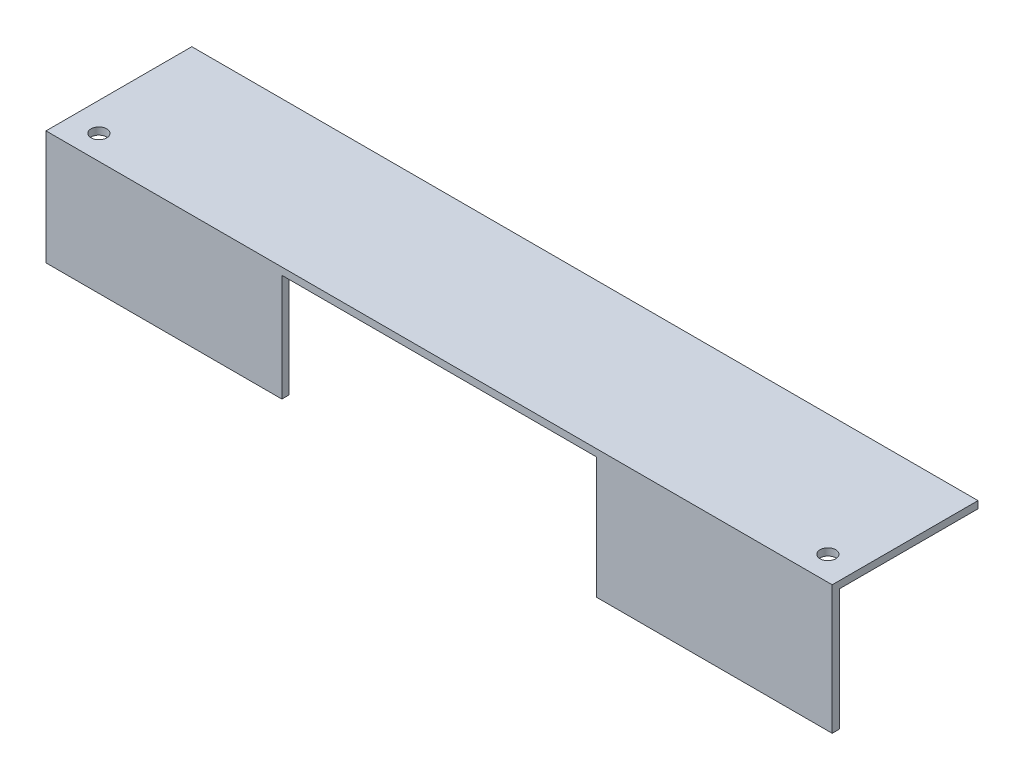
ISO-10303-21;
HEADER;
FILE_DESCRIPTION(('STEP AP214'),'2;1');
FILE_NAME('part.step','',(''),(''),'','','');
FILE_SCHEMA(('AUTOMOTIVE_DESIGN { 1 0 10303 214 1 1 1 1 }'));
ENDSEC;
DATA;
#1=APPLICATION_CONTEXT('core data for automotive mechanical design processes');
#2=APPLICATION_PROTOCOL_DEFINITION('international standard','automotive_design',2000,#1);
#3=PRODUCT_CONTEXT('',#1,'mechanical');
#4=PRODUCT('Part','Part','',(#3));
#5=PRODUCT_RELATED_PRODUCT_CATEGORY('part','',(#4));
#6=PRODUCT_DEFINITION_FORMATION('','',#4);
#7=PRODUCT_DEFINITION_CONTEXT('part definition',#1,'design');
#8=PRODUCT_DEFINITION('design','',#6,#7);
#9=PRODUCT_DEFINITION_SHAPE('','',#8);
#10=(LENGTH_UNIT() NAMED_UNIT(*) SI_UNIT(.MILLI.,.METRE.));
#11=(NAMED_UNIT(*) PLANE_ANGLE_UNIT() SI_UNIT($,.RADIAN.));
#12=(NAMED_UNIT(*) SI_UNIT($,.STERADIAN.) SOLID_ANGLE_UNIT());
#13=UNCERTAINTY_MEASURE_WITH_UNIT(LENGTH_MEASURE(1.E-05),#10,'distance_accuracy_value','');
#14=(GEOMETRIC_REPRESENTATION_CONTEXT(3) GLOBAL_UNCERTAINTY_ASSIGNED_CONTEXT((#13)) GLOBAL_UNIT_ASSIGNED_CONTEXT((#10,
#11,#12)) REPRESENTATION_CONTEXT('',''));
#15=CARTESIAN_POINT('',(0.,0.,0.));
#16=DIRECTION('',(0.,0.,1.));
#17=DIRECTION('',(1.,0.,0.));
#18=AXIS2_PLACEMENT_3D('',#15,#16,#17);
#19=CARTESIAN_POINT('',(22.,0.999999999999996,10.7));
#20=DIRECTION('',(1.,0.,0.));
#21=DIRECTION('',(0.,1.,0.));
#22=AXIS2_PLACEMENT_3D('',#19,#20,#21);
#23=PLANE('',#22);
#24=DIRECTION('',(0.,0.,-1.));
#25=VECTOR('',#24,1.);
#26=CARTESIAN_POINT('',(22.,0.,9.7));
#27=LINE('',#26,#25);
#28=CARTESIAN_POINT('',(22.,0.,10.7));
#29=VERTEX_POINT('',#28);
#30=CARTESIAN_POINT('',(22.,0.,9.7));
#31=VERTEX_POINT('',#30);
#32=EDGE_CURVE('E149',#29,#31,#27,.T.);
#33=ORIENTED_EDGE('',*,*,#32,.T.);
#34=DIRECTION('',(0.,-1.,0.));
#35=VECTOR('',#34,1.);
#36=CARTESIAN_POINT('',(22.,0.999999999999996,9.7));
#37=LINE('',#36,#35);
#38=CARTESIAN_POINT('',(22.,-17.,9.7));
#39=VERTEX_POINT('',#38);
#40=EDGE_CURVE('E98',#31,#39,#37,.T.);
#41=ORIENTED_EDGE('',*,*,#40,.T.);
#42=DIRECTION('',(0.,0.,-1.));
#43=VECTOR('',#42,1.);
#44=CARTESIAN_POINT('',(22.,-17.,10.7));
#45=LINE('',#44,#43);
#46=CARTESIAN_POINT('',(22.,-17.,10.7));
#47=VERTEX_POINT('',#46);
#48=EDGE_CURVE('E89',#47,#39,#45,.T.);
#49=ORIENTED_EDGE('',*,*,#48,.F.);
#50=DIRECTION('',(0.,-1.,0.));
#51=VECTOR('',#50,1.);
#52=CARTESIAN_POINT('',(22.,0.999999999999996,10.7));
#53=LINE('',#52,#51);
#54=EDGE_CURVE('E175',#29,#47,#53,.T.);
#55=ORIENTED_EDGE('',*,*,#54,.F.);
#56=EDGE_LOOP('',(#33,#41,#49,#55));
#57=FACE_BOUND('',#56,.T.);
#58=ADVANCED_FACE('F36',(#57),#23,.F.);
#59=CARTESIAN_POINT('',(-22.,1.,10.7));
#60=DIRECTION('',(-1.,0.,0.));
#61=DIRECTION('',(0.,-1.,0.));
#62=AXIS2_PLACEMENT_3D('',#59,#60,#61);
#63=PLANE('',#62);
#64=DIRECTION('',(0.,0.,1.));
#65=VECTOR('',#64,1.);
#66=CARTESIAN_POINT('',(-22.,0.,9.7));
#67=LINE('',#66,#65);
#68=CARTESIAN_POINT('',(-22.,0.,9.7));
#69=VERTEX_POINT('',#68);
#70=CARTESIAN_POINT('',(-22.,0.,10.7));
#71=VERTEX_POINT('',#70);
#72=EDGE_CURVE('E132',#69,#71,#67,.T.);
#73=ORIENTED_EDGE('',*,*,#72,.T.);
#74=DIRECTION('',(0.,1.,0.));
#75=VECTOR('',#74,1.);
#76=CARTESIAN_POINT('',(-22.,1.,10.7));
#77=LINE('',#76,#75);
#78=CARTESIAN_POINT('',(-22.,-15.,10.7));
#79=VERTEX_POINT('',#78);
#80=EDGE_CURVE('E160',#79,#71,#77,.T.);
#81=ORIENTED_EDGE('',*,*,#80,.F.);
#82=DIRECTION('',(0.,0.,-1.));
#83=VECTOR('',#82,1.);
#84=CARTESIAN_POINT('',(-22.,-15.,10.7));
#85=LINE('',#84,#83);
#86=CARTESIAN_POINT('',(-22.,-15.,9.7));
#87=VERTEX_POINT('',#86);
#88=EDGE_CURVE('E110',#79,#87,#85,.T.);
#89=ORIENTED_EDGE('',*,*,#88,.T.);
#90=DIRECTION('',(0.,1.,0.));
#91=VECTOR('',#90,1.);
#92=CARTESIAN_POINT('',(-22.,1.,9.7));
#93=LINE('',#92,#91);
#94=EDGE_CURVE('E157',#87,#69,#93,.T.);
#95=ORIENTED_EDGE('',*,*,#94,.T.);
#96=EDGE_LOOP('',(#73,#81,#89,#95));
#97=FACE_BOUND('',#96,.T.);
#98=ADVANCED_FACE('F223',(#97),#63,.F.);
#99=CARTESIAN_POINT('',(55.,1.,-9.7));
#100=DIRECTION('',(-1.,0.,0.));
#101=DIRECTION('',(0.,0.,1.));
#102=AXIS2_PLACEMENT_3D('',#99,#100,#101);
#103=PLANE('',#102);
#104=DIRECTION('',(0.,0.,-1.));
#105=VECTOR('',#104,1.);
#106=CARTESIAN_POINT('',(55.,0.,-9.7));
#107=LINE('',#106,#105);
#108=CARTESIAN_POINT('',(55.,0.,9.7));
#109=VERTEX_POINT('',#108);
#110=CARTESIAN_POINT('',(55.,0.,-9.7));
#111=VERTEX_POINT('',#110);
#112=EDGE_CURVE('E78',#109,#111,#107,.T.);
#113=ORIENTED_EDGE('',*,*,#112,.T.);
#114=DIRECTION('',(0.,-1.,0.));
#115=VECTOR('',#114,1.);
#116=CARTESIAN_POINT('',(55.,1.,-9.7));
#117=LINE('',#116,#115);
#118=CARTESIAN_POINT('',(55.,1.,-9.7));
#119=VERTEX_POINT('',#118);
#120=EDGE_CURVE('E11',#119,#111,#117,.T.);
#121=ORIENTED_EDGE('',*,*,#120,.F.);
#122=DIRECTION('',(0.,0.,-1.));
#123=VECTOR('',#122,1.);
#124=CARTESIAN_POINT('',(55.,1.,-9.7));
#125=LINE('',#124,#123);
#126=CARTESIAN_POINT('',(55.,1.,10.7));
#127=VERTEX_POINT('',#126);
#128=EDGE_CURVE('E122',#127,#119,#125,.T.);
#129=ORIENTED_EDGE('',*,*,#128,.F.);
#130=DIRECTION('',(0.,1.,0.));
#131=VECTOR('',#130,1.);
#132=CARTESIAN_POINT('',(55.,1.,10.7));
#133=LINE('',#132,#131);
#134=CARTESIAN_POINT('',(55.,-17.,10.7));
#135=VERTEX_POINT('',#134);
#136=EDGE_CURVE('E118',#135,#127,#133,.T.);
#137=ORIENTED_EDGE('',*,*,#136,.F.);
#138=DIRECTION('',(0.,0.,-1.));
#139=VECTOR('',#138,1.);
#140=CARTESIAN_POINT('',(55.,-17.,10.7));
#141=LINE('',#140,#139);
#142=CARTESIAN_POINT('',(55.,-17.,9.7));
#143=VERTEX_POINT('',#142);
#144=EDGE_CURVE('E104',#135,#143,#141,.T.);
#145=ORIENTED_EDGE('',*,*,#144,.T.);
#146=DIRECTION('',(0.,1.,0.));
#147=VECTOR('',#146,1.);
#148=CARTESIAN_POINT('',(55.,1.,9.7));
#149=LINE('',#148,#147);
#150=EDGE_CURVE('E96',#143,#109,#149,.T.);
#151=ORIENTED_EDGE('',*,*,#150,.T.);
#152=EDGE_LOOP('',(#113,#121,#129,#137,#145,#151));
#153=FACE_BOUND('',#152,.T.);
#154=ADVANCED_FACE('F38',(#153),#103,.F.);
#155=CARTESIAN_POINT('',(-55.,1.,-9.7));
#156=DIRECTION('',(0.,0.,1.));
#157=DIRECTION('',(1.,0.,0.));
#158=AXIS2_PLACEMENT_3D('',#155,#156,#157);
#159=PLANE('',#158);
#160=DIRECTION('',(-1.,0.,0.));
#161=VECTOR('',#160,1.);
#162=CARTESIAN_POINT('',(-55.,0.,-9.7));
#163=LINE('',#162,#161);
#164=CARTESIAN_POINT('',(-55.,0.,-9.7));
#165=VERTEX_POINT('',#164);
#166=EDGE_CURVE('E85',#111,#165,#163,.T.);
#167=ORIENTED_EDGE('',*,*,#166,.T.);
#168=DIRECTION('',(0.,-1.,0.));
#169=VECTOR('',#168,1.);
#170=CARTESIAN_POINT('',(-55.,1.,-9.7));
#171=LINE('',#170,#169);
#172=CARTESIAN_POINT('',(-55.,1.,-9.7));
#173=VERTEX_POINT('',#172);
#174=EDGE_CURVE('E46',#173,#165,#171,.T.);
#175=ORIENTED_EDGE('',*,*,#174,.F.);
#176=DIRECTION('',(-1.,0.,0.));
#177=VECTOR('',#176,1.);
#178=CARTESIAN_POINT('',(-55.,1.,-9.7));
#179=LINE('',#178,#177);
#180=EDGE_CURVE('E55',#119,#173,#179,.T.);
#181=ORIENTED_EDGE('',*,*,#180,.F.);
#182=ORIENTED_EDGE('',*,*,#120,.T.);
#183=EDGE_LOOP('',(#167,#175,#181,#182));
#184=FACE_BOUND('',#183,.T.);
#185=ADVANCED_FACE('F231',(#184),#159,.F.);
#186=CARTESIAN_POINT('',(-55.,1.,-9.7));
#187=DIRECTION('',(1.,0.,0.));
#188=DIRECTION('',(0.,0.,-1.));
#189=AXIS2_PLACEMENT_3D('',#186,#187,#188);
#190=PLANE('',#189);
#191=DIRECTION('',(0.,0.,1.));
#192=VECTOR('',#191,1.);
#193=CARTESIAN_POINT('',(-55.,0.,-9.7));
#194=LINE('',#193,#192);
#195=CARTESIAN_POINT('',(-55.,0.,9.7));
#196=VERTEX_POINT('',#195);
#197=EDGE_CURVE('E72',#165,#196,#194,.T.);
#198=ORIENTED_EDGE('',*,*,#197,.T.);
#199=DIRECTION('',(0.,-1.,0.));
#200=VECTOR('',#199,1.);
#201=CARTESIAN_POINT('',(-55.,1.,9.7));
#202=LINE('',#201,#200);
#203=CARTESIAN_POINT('',(-55.,-15.,9.7));
#204=VERTEX_POINT('',#203);
#205=EDGE_CURVE('E152',#196,#204,#202,.T.);
#206=ORIENTED_EDGE('',*,*,#205,.T.);
#207=DIRECTION('',(0.,0.,-1.));
#208=VECTOR('',#207,1.);
#209=CARTESIAN_POINT('',(-55.,-15.,10.7));
#210=LINE('',#209,#208);
#211=CARTESIAN_POINT('',(-55.,-15.,10.7));
#212=VERTEX_POINT('',#211);
#213=EDGE_CURVE('E105',#212,#204,#210,.T.);
#214=ORIENTED_EDGE('',*,*,#213,.F.);
#215=DIRECTION('',(0.,-1.,0.));
#216=VECTOR('',#215,1.);
#217=CARTESIAN_POINT('',(-55.,1.,10.7));
#218=LINE('',#217,#216);
#219=CARTESIAN_POINT('',(-55.,1.,10.7));
#220=VERTEX_POINT('',#219);
#221=EDGE_CURVE('E153',#220,#212,#218,.T.);
#222=ORIENTED_EDGE('',*,*,#221,.F.);
#223=DIRECTION('',(0.,0.,1.));
#224=VECTOR('',#223,1.);
#225=CARTESIAN_POINT('',(-55.,1.,-9.7));
#226=LINE('',#225,#224);
#227=EDGE_CURVE('E125',#173,#220,#226,.T.);
#228=ORIENTED_EDGE('',*,*,#227,.F.);
#229=ORIENTED_EDGE('',*,*,#174,.T.);
#230=EDGE_LOOP('',(#198,#206,#214,#222,#228,#229));
#231=FACE_BOUND('',#230,.T.);
#232=ADVANCED_FACE('F229',(#231),#190,.F.);
#233=CARTESIAN_POINT('',(0.,1.,0.));
#234=DIRECTION('',(0.,1.,0.));
#235=DIRECTION('',(0.,0.,1.));
#236=AXIS2_PLACEMENT_3D('',#233,#234,#235);
#237=PLANE('',#236);
#238=CARTESIAN_POINT('',(-51.,1.,7.3));
#239=DIRECTION('',(0.,-1.,0.));
#240=DIRECTION('',(0.,0.,1.));
#241=AXIS2_PLACEMENT_3D('',#238,#239,#240);
#242=CIRCLE('',#241,1.1);
#243=CARTESIAN_POINT('',(-51.,1.,8.4));
#244=VERTEX_POINT('',#243);
#245=EDGE_CURVE('E144',#244,#244,#242,.T.);
#246=ORIENTED_EDGE('',*,*,#245,.T.);
#247=EDGE_LOOP('',(#246));
#248=FACE_BOUND('',#247,.T.);
#249=CARTESIAN_POINT('',(51.,1.,7.3));
#250=DIRECTION('',(0.,1.,0.));
#251=DIRECTION('',(0.,0.,1.));
#252=AXIS2_PLACEMENT_3D('',#249,#250,#251);
#253=CIRCLE('',#252,1.1);
#254=CARTESIAN_POINT('',(51.,1.,8.4));
#255=VERTEX_POINT('',#254);
#256=EDGE_CURVE('E133',#255,#255,#253,.T.);
#257=ORIENTED_EDGE('',*,*,#256,.F.);
#258=EDGE_LOOP('',(#257));
#259=FACE_BOUND('',#258,.T.);
#260=ORIENTED_EDGE('',*,*,#128,.T.);
#261=ORIENTED_EDGE('',*,*,#180,.T.);
#262=ORIENTED_EDGE('',*,*,#227,.T.);
#263=DIRECTION('',(-1.,0.,0.));
#264=VECTOR('',#263,1.);
#265=CARTESIAN_POINT('',(55.,1.,10.7));
#266=LINE('',#265,#264);
#267=EDGE_CURVE('E173',#127,#220,#266,.T.);
#268=ORIENTED_EDGE('',*,*,#267,.F.);
#269=EDGE_LOOP('',(#260,#261,#262,#268));
#270=FACE_BOUND('',#269,.T.);
#271=ADVANCED_FACE('F191',(#248,#259,#270),#237,.T.);
#272=CARTESIAN_POINT('',(0.,0.,0.));
#273=DIRECTION('',(0.,1.,0.));
#274=DIRECTION('',(0.,0.,1.));
#275=AXIS2_PLACEMENT_3D('',#272,#273,#274);
#276=PLANE('',#275);
#277=CARTESIAN_POINT('',(-51.,0.,7.3));
#278=DIRECTION('',(0.,1.,0.));
#279=DIRECTION('',(0.,0.,1.));
#280=AXIS2_PLACEMENT_3D('',#277,#278,#279);
#281=CIRCLE('',#280,1.1);
#282=CARTESIAN_POINT('',(-51.,0.,8.4));
#283=VERTEX_POINT('',#282);
#284=EDGE_CURVE('E40',#283,#283,#281,.F.);
#285=ORIENTED_EDGE('',*,*,#284,.F.);
#286=EDGE_LOOP('',(#285));
#287=FACE_BOUND('',#286,.T.);
#288=CARTESIAN_POINT('',(51.,0.,7.3));
#289=DIRECTION('',(0.,1.,0.));
#290=DIRECTION('',(0.,0.,1.));
#291=AXIS2_PLACEMENT_3D('',#288,#289,#290);
#292=CIRCLE('',#291,1.1);
#293=CARTESIAN_POINT('',(51.,0.,8.4));
#294=VERTEX_POINT('',#293);
#295=EDGE_CURVE('E130',#294,#294,#292,.T.);
#296=ORIENTED_EDGE('',*,*,#295,.T.);
#297=EDGE_LOOP('',(#296));
#298=FACE_BOUND('',#297,.T.);
#299=ORIENTED_EDGE('',*,*,#112,.F.);
#300=DIRECTION('',(1.,0.,0.));
#301=VECTOR('',#300,1.);
#302=CARTESIAN_POINT('',(-55.,0.,9.7));
#303=LINE('',#302,#301);
#304=EDGE_CURVE('E83',#31,#109,#303,.T.);
#305=ORIENTED_EDGE('',*,*,#304,.F.);
#306=ORIENTED_EDGE('',*,*,#32,.F.);
#307=DIRECTION('',(1.,0.,0.));
#308=VECTOR('',#307,1.);
#309=CARTESIAN_POINT('',(-22.,0.,10.7));
#310=LINE('',#309,#308);
#311=EDGE_CURVE('E137',#71,#29,#310,.T.);
#312=ORIENTED_EDGE('',*,*,#311,.F.);
#313=ORIENTED_EDGE('',*,*,#72,.F.);
#314=EDGE_CURVE('E99',#196,#69,#303,.T.);
#315=ORIENTED_EDGE('',*,*,#314,.F.);
#316=ORIENTED_EDGE('',*,*,#197,.F.);
#317=ORIENTED_EDGE('',*,*,#166,.F.);
#318=EDGE_LOOP('',(#299,#305,#306,#312,#313,#315,#316,#317));
#319=FACE_BOUND('',#318,.T.);
#320=ADVANCED_FACE('F80',(#287,#298,#319),#276,.F.);
#321=CARTESIAN_POINT('',(55.,-17.,10.7));
#322=DIRECTION('',(0.,1.,0.));
#323=DIRECTION('',(-1.,0.,0.));
#324=AXIS2_PLACEMENT_3D('',#321,#322,#323);
#325=PLANE('',#324);
#326=DIRECTION('',(1.,0.,0.));
#327=VECTOR('',#326,1.);
#328=CARTESIAN_POINT('',(55.,-17.,9.7));
#329=LINE('',#328,#327);
#330=EDGE_CURVE('E107',#39,#143,#329,.T.);
#331=ORIENTED_EDGE('',*,*,#330,.T.);
#332=ORIENTED_EDGE('',*,*,#144,.F.);
#333=DIRECTION('',(1.,0.,0.));
#334=VECTOR('',#333,1.);
#335=CARTESIAN_POINT('',(55.,-17.,10.7));
#336=LINE('',#335,#334);
#337=EDGE_CURVE('E113',#47,#135,#336,.T.);
#338=ORIENTED_EDGE('',*,*,#337,.F.);
#339=ORIENTED_EDGE('',*,*,#48,.T.);
#340=EDGE_LOOP('',(#331,#332,#338,#339));
#341=FACE_BOUND('',#340,.T.);
#342=ADVANCED_FACE('F187',(#341),#325,.F.);
#343=CARTESIAN_POINT('',(0.,0.,10.7));
#344=DIRECTION('',(0.,0.,-1.));
#345=DIRECTION('',(-1.,0.,0.));
#346=AXIS2_PLACEMENT_3D('',#343,#344,#345);
#347=PLANE('',#346);
#348=ORIENTED_EDGE('',*,*,#136,.T.);
#349=ORIENTED_EDGE('',*,*,#267,.T.);
#350=ORIENTED_EDGE('',*,*,#221,.T.);
#351=DIRECTION('',(1.,0.,0.));
#352=VECTOR('',#351,1.);
#353=CARTESIAN_POINT('',(-55.,-15.,10.7));
#354=LINE('',#353,#352);
#355=EDGE_CURVE('E156',#212,#79,#354,.T.);
#356=ORIENTED_EDGE('',*,*,#355,.T.);
#357=ORIENTED_EDGE('',*,*,#80,.T.);
#358=ORIENTED_EDGE('',*,*,#311,.T.);
#359=ORIENTED_EDGE('',*,*,#54,.T.);
#360=ORIENTED_EDGE('',*,*,#337,.T.);
#361=EDGE_LOOP('',(#348,#349,#350,#356,#357,#358,#359,#360));
#362=FACE_BOUND('',#361,.T.);
#363=ADVANCED_FACE('F183',(#362),#347,.F.);
#364=CARTESIAN_POINT('',(0.,0.,9.7));
#365=DIRECTION('',(0.,0.,-1.));
#366=DIRECTION('',(-1.,0.,0.));
#367=AXIS2_PLACEMENT_3D('',#364,#365,#366);
#368=PLANE('',#367);
#369=ORIENTED_EDGE('',*,*,#40,.F.);
#370=ORIENTED_EDGE('',*,*,#304,.T.);
#371=ORIENTED_EDGE('',*,*,#150,.F.);
#372=ORIENTED_EDGE('',*,*,#330,.F.);
#373=EDGE_LOOP('',(#369,#370,#371,#372));
#374=FACE_BOUND('',#373,.T.);
#375=ADVANCED_FACE('F93',(#374),#368,.T.);
#376=CARTESIAN_POINT('',(0.,0.,9.7));
#377=DIRECTION('',(0.,0.,1.));
#378=DIRECTION('',(1.,0.,0.));
#379=AXIS2_PLACEMENT_3D('',#376,#377,#378);
#380=PLANE('',#379);
#381=ORIENTED_EDGE('',*,*,#205,.F.);
#382=ORIENTED_EDGE('',*,*,#314,.T.);
#383=ORIENTED_EDGE('',*,*,#94,.F.);
#384=DIRECTION('',(1.,0.,0.));
#385=VECTOR('',#384,1.);
#386=CARTESIAN_POINT('',(-55.,-15.,9.7));
#387=LINE('',#386,#385);
#388=EDGE_CURVE('E164',#204,#87,#387,.T.);
#389=ORIENTED_EDGE('',*,*,#388,.F.);
#390=EDGE_LOOP('',(#381,#382,#383,#389));
#391=FACE_BOUND('',#390,.T.);
#392=ADVANCED_FACE('F228',(#391),#380,.F.);
#393=CARTESIAN_POINT('',(-55.,-15.,10.7));
#394=DIRECTION('',(0.,1.,0.));
#395=DIRECTION('',(0.,0.,1.));
#396=AXIS2_PLACEMENT_3D('',#393,#394,#395);
#397=PLANE('',#396);
#398=ORIENTED_EDGE('',*,*,#388,.T.);
#399=ORIENTED_EDGE('',*,*,#88,.F.);
#400=ORIENTED_EDGE('',*,*,#355,.F.);
#401=ORIENTED_EDGE('',*,*,#213,.T.);
#402=EDGE_LOOP('',(#398,#399,#400,#401));
#403=FACE_BOUND('',#402,.T.);
#404=ADVANCED_FACE('F225',(#403),#397,.F.);
#405=CARTESIAN_POINT('',(51.,-9.,7.3));
#406=DIRECTION('',(0.,1.,0.));
#407=DIRECTION('',(0.,0.,1.));
#408=AXIS2_PLACEMENT_3D('',#405,#406,#407);
#409=CYLINDRICAL_SURFACE('',#408,1.1);
#410=ORIENTED_EDGE('',*,*,#256,.T.);
#411=EDGE_LOOP('',(#410));
#412=FACE_BOUND('',#411,.T.);
#413=ORIENTED_EDGE('',*,*,#295,.F.);
#414=EDGE_LOOP('',(#413));
#415=FACE_BOUND('',#414,.T.);
#416=ADVANCED_FACE('F261',(#412,#415),#409,.F.);
#417=CARTESIAN_POINT('',(-51.,-9.,7.3));
#418=DIRECTION('',(0.,1.,0.));
#419=DIRECTION('',(0.,0.,1.));
#420=AXIS2_PLACEMENT_3D('',#417,#418,#419);
#421=CYLINDRICAL_SURFACE('',#420,1.1);
#422=ORIENTED_EDGE('',*,*,#245,.F.);
#423=EDGE_LOOP('',(#422));
#424=FACE_BOUND('',#423,.T.);
#425=ORIENTED_EDGE('',*,*,#284,.T.);
#426=EDGE_LOOP('',(#425));
#427=FACE_BOUND('',#426,.T.);
#428=ADVANCED_FACE('F259',(#424,#427),#421,.F.);
#429=CLOSED_SHELL('',(#58,#98,#154,#185,#232,#271,#320,#342,#363,#375,#392,#404,#416,#428));
#430=MANIFOLD_SOLID_BREP('B2',#429);
#431=ADVANCED_BREP_SHAPE_REPRESENTATION('',(#18,#430),#14);
#432=SHAPE_DEFINITION_REPRESENTATION(#9,#431);
ENDSEC;
END-ISO-10303-21;
